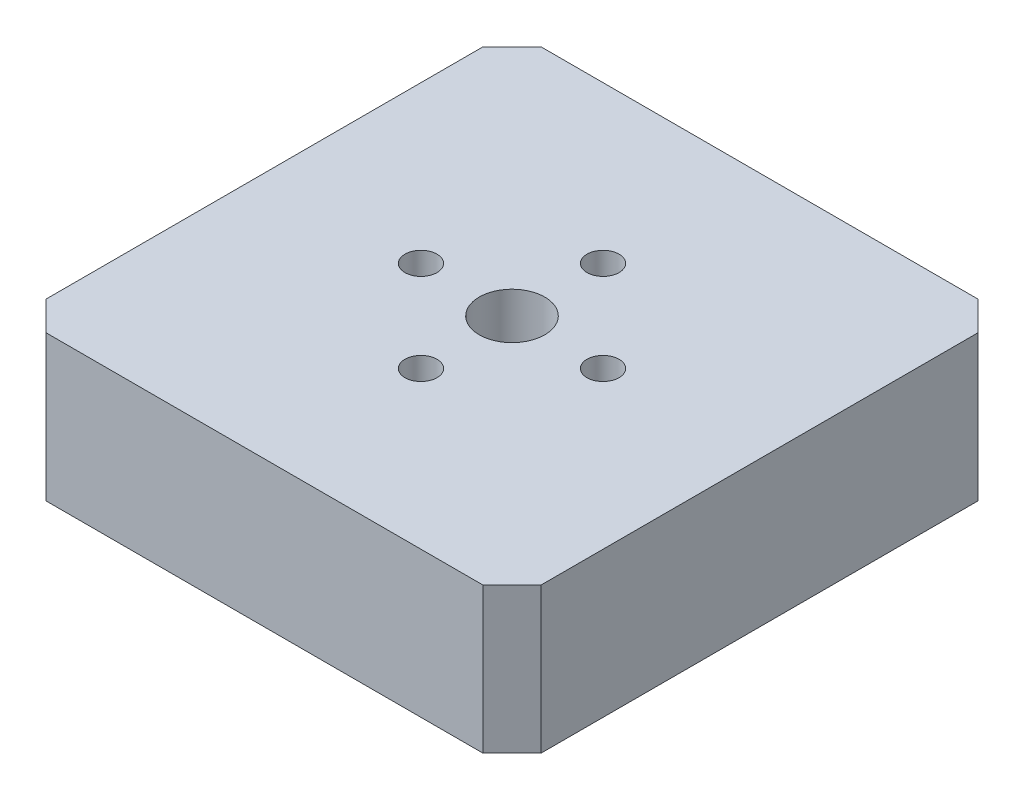
ISO-10303-21;
HEADER;
FILE_DESCRIPTION(('STEP AP214'),'2;1');
FILE_NAME('part.step','',(''),(''),'','','');
FILE_SCHEMA(('AUTOMOTIVE_DESIGN { 1 0 10303 214 1 1 1 1 }'));
ENDSEC;
DATA;
#1=APPLICATION_CONTEXT('core data for automotive mechanical design processes');
#2=APPLICATION_PROTOCOL_DEFINITION('international standard','automotive_design',2000,#1);
#3=PRODUCT_CONTEXT('',#1,'mechanical');
#4=PRODUCT('Part','Part','',(#3));
#5=PRODUCT_RELATED_PRODUCT_CATEGORY('part','',(#4));
#6=PRODUCT_DEFINITION_FORMATION('','',#4);
#7=PRODUCT_DEFINITION_CONTEXT('part definition',#1,'design');
#8=PRODUCT_DEFINITION('design','',#6,#7);
#9=PRODUCT_DEFINITION_SHAPE('','',#8);
#10=(LENGTH_UNIT() NAMED_UNIT(*) SI_UNIT(.MILLI.,.METRE.));
#11=(NAMED_UNIT(*) PLANE_ANGLE_UNIT() SI_UNIT($,.RADIAN.));
#12=(NAMED_UNIT(*) SI_UNIT($,.STERADIAN.) SOLID_ANGLE_UNIT());
#13=UNCERTAINTY_MEASURE_WITH_UNIT(LENGTH_MEASURE(1.E-05),#10,'distance_accuracy_value','');
#14=(GEOMETRIC_REPRESENTATION_CONTEXT(3) GLOBAL_UNCERTAINTY_ASSIGNED_CONTEXT((#13)) GLOBAL_UNIT_ASSIGNED_CONTEXT((#10,
#11,#12)) REPRESENTATION_CONTEXT('',''));
#15=CARTESIAN_POINT('',(0.,0.,0.));
#16=DIRECTION('',(0.,0.,1.));
#17=DIRECTION('',(1.,0.,0.));
#18=AXIS2_PLACEMENT_3D('',#15,#16,#17);
#19=CARTESIAN_POINT('',(0.,0.,0.));
#20=DIRECTION('',(0.,-1.,0.));
#21=DIRECTION('',(0.,0.,-1.));
#22=AXIS2_PLACEMENT_3D('',#19,#20,#21);
#23=PLANE('',#22);
#24=DIRECTION('',(1.,0.,0.));
#25=VECTOR('',#24,1.);
#26=CARTESIAN_POINT('',(-17.,0.,17.));
#27=LINE('',#26,#25);
#28=CARTESIAN_POINT('',(-15.,0.,17.));
#29=VERTEX_POINT('',#28);
#30=CARTESIAN_POINT('',(15.,0.,17.));
#31=VERTEX_POINT('',#30);
#32=EDGE_CURVE('E216',#29,#31,#27,.T.);
#33=ORIENTED_EDGE('',*,*,#32,.F.);
#34=DIRECTION('',(-0.707106781186546,0.,-0.707106781186549));
#35=VECTOR('',#34,1.);
#36=CARTESIAN_POINT('',(-16.,0.,16.));
#37=LINE('',#36,#35);
#38=CARTESIAN_POINT('',(-17.,0.,15.));
#39=VERTEX_POINT('',#38);
#40=EDGE_CURVE('E266',#29,#39,#37,.T.);
#41=ORIENTED_EDGE('',*,*,#40,.T.);
#42=DIRECTION('',(0.,0.,-1.));
#43=VECTOR('',#42,1.);
#44=CARTESIAN_POINT('',(-17.,0.,17.));
#45=LINE('',#44,#43);
#46=CARTESIAN_POINT('',(-17.,0.,-15.));
#47=VERTEX_POINT('',#46);
#48=EDGE_CURVE('E210',#39,#47,#45,.T.);
#49=ORIENTED_EDGE('',*,*,#48,.T.);
#50=DIRECTION('',(-0.707106781186549,0.,0.707106781186546));
#51=VECTOR('',#50,1.);
#52=CARTESIAN_POINT('',(-16.,0.,-16.));
#53=LINE('',#52,#51);
#54=CARTESIAN_POINT('',(-15.,0.,-17.));
#55=VERTEX_POINT('',#54);
#56=EDGE_CURVE('E260',#47,#55,#53,.F.);
#57=ORIENTED_EDGE('',*,*,#56,.T.);
#58=DIRECTION('',(1.,0.,0.));
#59=VECTOR('',#58,1.);
#60=CARTESIAN_POINT('',(-17.,0.,-17.));
#61=LINE('',#60,#59);
#62=CARTESIAN_POINT('',(15.,0.,-17.));
#63=VERTEX_POINT('',#62);
#64=EDGE_CURVE('E225',#55,#63,#61,.T.);
#65=ORIENTED_EDGE('',*,*,#64,.T.);
#66=DIRECTION('',(0.707106781186546,0.,0.707106781186549));
#67=VECTOR('',#66,1.);
#68=CARTESIAN_POINT('',(16.,0.,-16.));
#69=LINE('',#68,#67);
#70=CARTESIAN_POINT('',(17.,0.,-15.));
#71=VERTEX_POINT('',#70);
#72=EDGE_CURVE('E262',#63,#71,#69,.T.);
#73=ORIENTED_EDGE('',*,*,#72,.T.);
#74=DIRECTION('',(0.,0.,-1.));
#75=VECTOR('',#74,1.);
#76=CARTESIAN_POINT('',(17.,0.,17.));
#77=LINE('',#76,#75);
#78=CARTESIAN_POINT('',(17.,0.,15.));
#79=VERTEX_POINT('',#78);
#80=EDGE_CURVE('E228',#79,#71,#77,.T.);
#81=ORIENTED_EDGE('',*,*,#80,.F.);
#82=DIRECTION('',(0.707106781186549,0.,-0.707106781186546));
#83=VECTOR('',#82,1.);
#84=CARTESIAN_POINT('',(16.,0.,16.));
#85=LINE('',#84,#83);
#86=EDGE_CURVE('E264',#79,#31,#85,.F.);
#87=ORIENTED_EDGE('',*,*,#86,.T.);
#88=EDGE_LOOP('',(#33,#41,#49,#57,#65,#73,#81,#87));
#89=FACE_BOUND('',#88,.T.);
#90=DIRECTION('',(0.,0.,-1.));
#91=VECTOR('',#90,1.);
#92=CARTESIAN_POINT('',(-15.,0.,0.));
#93=LINE('',#92,#91);
#94=CARTESIAN_POINT('',(-15.,0.,13.));
#95=VERTEX_POINT('',#94);
#96=CARTESIAN_POINT('',(-15.,0.,-13.));
#97=VERTEX_POINT('',#96);
#98=EDGE_CURVE('E198',#95,#97,#93,.T.);
#99=ORIENTED_EDGE('',*,*,#98,.F.);
#100=DIRECTION('',(0.707106781186544,0.,0.707106781186551));
#101=VECTOR('',#100,1.);
#102=CARTESIAN_POINT('',(-15.,0.,13.));
#103=LINE('',#102,#101);
#104=CARTESIAN_POINT('',(-13.,0.,15.));
#105=VERTEX_POINT('',#104);
#106=EDGE_CURVE('E12',#95,#105,#103,.T.);
#107=ORIENTED_EDGE('',*,*,#106,.T.);
#108=DIRECTION('',(1.,0.,0.));
#109=VECTOR('',#108,1.);
#110=CARTESIAN_POINT('',(0.,0.,15.));
#111=LINE('',#110,#109);
#112=CARTESIAN_POINT('',(13.,0.,15.));
#113=VERTEX_POINT('',#112);
#114=EDGE_CURVE('E203',#105,#113,#111,.T.);
#115=ORIENTED_EDGE('',*,*,#114,.T.);
#116=DIRECTION('',(-0.707106781186551,0.,0.707106781186544));
#117=VECTOR('',#116,1.);
#118=CARTESIAN_POINT('',(13.,0.,15.));
#119=LINE('',#118,#117);
#120=CARTESIAN_POINT('',(15.,0.,13.));
#121=VERTEX_POINT('',#120);
#122=EDGE_CURVE('E67',#113,#121,#119,.F.);
#123=ORIENTED_EDGE('',*,*,#122,.T.);
#124=DIRECTION('',(0.,0.,-1.));
#125=VECTOR('',#124,1.);
#126=CARTESIAN_POINT('',(15.,0.,0.));
#127=LINE('',#126,#125);
#128=CARTESIAN_POINT('',(15.,0.,-13.));
#129=VERTEX_POINT('',#128);
#130=EDGE_CURVE('E199',#121,#129,#127,.T.);
#131=ORIENTED_EDGE('',*,*,#130,.T.);
#132=DIRECTION('',(-0.707106781186544,0.,-0.707106781186551));
#133=VECTOR('',#132,1.);
#134=CARTESIAN_POINT('',(15.,0.,-13.));
#135=LINE('',#134,#133);
#136=CARTESIAN_POINT('',(13.,0.,-15.));
#137=VERTEX_POINT('',#136);
#138=EDGE_CURVE('E183',#129,#137,#135,.T.);
#139=ORIENTED_EDGE('',*,*,#138,.T.);
#140=DIRECTION('',(1.,0.,0.));
#141=VECTOR('',#140,1.);
#142=CARTESIAN_POINT('',(0.,0.,-15.));
#143=LINE('',#142,#141);
#144=CARTESIAN_POINT('',(-13.,0.,-15.));
#145=VERTEX_POINT('',#144);
#146=EDGE_CURVE('E190',#145,#137,#143,.T.);
#147=ORIENTED_EDGE('',*,*,#146,.F.);
#148=DIRECTION('',(0.707106781186551,0.,-0.707106781186544));
#149=VECTOR('',#148,1.);
#150=CARTESIAN_POINT('',(-13.,0.,-15.));
#151=LINE('',#150,#149);
#152=EDGE_CURVE('E173',#145,#97,#151,.F.);
#153=ORIENTED_EDGE('',*,*,#152,.T.);
#154=EDGE_LOOP('',(#99,#107,#115,#123,#131,#139,#147,#153));
#155=FACE_BOUND('',#154,.T.);
#156=ADVANCED_FACE('F58',(#89,#155),#23,.T.);
#157=CARTESIAN_POINT('',(0.,10.,0.));
#158=DIRECTION('',(0.,-1.,0.));
#159=DIRECTION('',(0.,0.,-1.));
#160=AXIS2_PLACEMENT_3D('',#157,#158,#159);
#161=PLANE('',#160);
#162=CARTESIAN_POINT('',(0.,10.,-6.25));
#163=DIRECTION('',(0.,-1.,0.));
#164=DIRECTION('',(0.,0.,-1.));
#165=AXIS2_PLACEMENT_3D('',#162,#163,#164);
#166=CIRCLE('',#165,1.1);
#167=CARTESIAN_POINT('',(0.,10.,-7.35));
#168=VERTEX_POINT('',#167);
#169=EDGE_CURVE('E357',#168,#168,#166,.T.);
#170=ORIENTED_EDGE('',*,*,#169,.T.);
#171=EDGE_LOOP('',(#170));
#172=FACE_BOUND('',#171,.T.);
#173=CARTESIAN_POINT('',(-6.25,10.,0.));
#174=DIRECTION('',(0.,-1.,0.));
#175=DIRECTION('',(0.,0.,-1.));
#176=AXIS2_PLACEMENT_3D('',#173,#174,#175);
#177=CIRCLE('',#176,1.1);
#178=CARTESIAN_POINT('',(-6.25,10.,-1.1));
#179=VERTEX_POINT('',#178);
#180=EDGE_CURVE('E345',#179,#179,#177,.T.);
#181=ORIENTED_EDGE('',*,*,#180,.T.);
#182=EDGE_LOOP('',(#181));
#183=FACE_BOUND('',#182,.T.);
#184=CARTESIAN_POINT('',(0.,10.,6.25));
#185=DIRECTION('',(0.,-1.,0.));
#186=DIRECTION('',(0.,0.,-1.));
#187=AXIS2_PLACEMENT_3D('',#184,#185,#186);
#188=CIRCLE('',#187,1.1);
#189=CARTESIAN_POINT('',(0.,10.,5.15));
#190=VERTEX_POINT('',#189);
#191=EDGE_CURVE('E333',#190,#190,#188,.T.);
#192=ORIENTED_EDGE('',*,*,#191,.T.);
#193=EDGE_LOOP('',(#192));
#194=FACE_BOUND('',#193,.T.);
#195=CARTESIAN_POINT('',(6.25,10.,0.));
#196=DIRECTION('',(0.,-1.,0.));
#197=DIRECTION('',(0.,0.,-1.));
#198=AXIS2_PLACEMENT_3D('',#195,#196,#197);
#199=CIRCLE('',#198,1.1);
#200=CARTESIAN_POINT('',(6.25,10.,-1.1));
#201=VERTEX_POINT('',#200);
#202=EDGE_CURVE('E319',#201,#201,#199,.T.);
#203=ORIENTED_EDGE('',*,*,#202,.T.);
#204=EDGE_LOOP('',(#203));
#205=FACE_BOUND('',#204,.T.);
#206=DIRECTION('',(0.,0.,-1.));
#207=VECTOR('',#206,1.);
#208=CARTESIAN_POINT('',(-17.,10.,17.));
#209=LINE('',#208,#207);
#210=CARTESIAN_POINT('',(-17.,10.,15.));
#211=VERTEX_POINT('',#210);
#212=CARTESIAN_POINT('',(-17.,10.,-15.));
#213=VERTEX_POINT('',#212);
#214=EDGE_CURVE('E212',#211,#213,#209,.T.);
#215=ORIENTED_EDGE('',*,*,#214,.F.);
#216=DIRECTION('',(0.707106781186546,0.,0.707106781186549));
#217=VECTOR('',#216,1.);
#218=CARTESIAN_POINT('',(-15.,10.,17.));
#219=LINE('',#218,#217);
#220=CARTESIAN_POINT('',(-15.,10.,17.));
#221=VERTEX_POINT('',#220);
#222=EDGE_CURVE('E278',#211,#221,#219,.T.);
#223=ORIENTED_EDGE('',*,*,#222,.T.);
#224=DIRECTION('',(1.,0.,0.));
#225=VECTOR('',#224,1.);
#226=CARTESIAN_POINT('',(-17.,10.,17.));
#227=LINE('',#226,#225);
#228=CARTESIAN_POINT('',(15.,10.,17.));
#229=VERTEX_POINT('',#228);
#230=EDGE_CURVE('E220',#221,#229,#227,.T.);
#231=ORIENTED_EDGE('',*,*,#230,.T.);
#232=DIRECTION('',(-0.707106781186549,0.,0.707106781186546));
#233=VECTOR('',#232,1.);
#234=CARTESIAN_POINT('',(17.,10.,15.));
#235=LINE('',#234,#233);
#236=CARTESIAN_POINT('',(17.,10.,15.));
#237=VERTEX_POINT('',#236);
#238=EDGE_CURVE('E276',#229,#237,#235,.F.);
#239=ORIENTED_EDGE('',*,*,#238,.T.);
#240=DIRECTION('',(0.,0.,-1.));
#241=VECTOR('',#240,1.);
#242=CARTESIAN_POINT('',(17.,10.,17.));
#243=LINE('',#242,#241);
#244=CARTESIAN_POINT('',(17.,10.,-15.));
#245=VERTEX_POINT('',#244);
#246=EDGE_CURVE('E218',#237,#245,#243,.T.);
#247=ORIENTED_EDGE('',*,*,#246,.T.);
#248=DIRECTION('',(-0.707106781186546,0.,-0.707106781186549));
#249=VECTOR('',#248,1.);
#250=CARTESIAN_POINT('',(15.,10.,-17.));
#251=LINE('',#250,#249);
#252=CARTESIAN_POINT('',(15.,10.,-17.));
#253=VERTEX_POINT('',#252);
#254=EDGE_CURVE('E74',#245,#253,#251,.T.);
#255=ORIENTED_EDGE('',*,*,#254,.T.);
#256=DIRECTION('',(1.,0.,0.));
#257=VECTOR('',#256,1.);
#258=CARTESIAN_POINT('',(-17.,10.,-17.));
#259=LINE('',#258,#257);
#260=CARTESIAN_POINT('',(-15.,10.,-17.));
#261=VERTEX_POINT('',#260);
#262=EDGE_CURVE('E215',#261,#253,#259,.T.);
#263=ORIENTED_EDGE('',*,*,#262,.F.);
#264=DIRECTION('',(0.707106781186549,0.,-0.707106781186546));
#265=VECTOR('',#264,1.);
#266=CARTESIAN_POINT('',(-17.,10.,-15.));
#267=LINE('',#266,#265);
#268=EDGE_CURVE('E273',#261,#213,#267,.F.);
#269=ORIENTED_EDGE('',*,*,#268,.T.);
#270=EDGE_LOOP('',(#215,#223,#231,#239,#247,#255,#263,#269));
#271=FACE_BOUND('',#270,.T.);
#272=CARTESIAN_POINT('',(0.,10.,0.));
#273=DIRECTION('',(0.,1.,0.));
#274=DIRECTION('',(0.,0.,1.));
#275=AXIS2_PLACEMENT_3D('',#272,#273,#274);
#276=CIRCLE('',#275,2.25);
#277=CARTESIAN_POINT('',(0.,10.,2.25));
#278=VERTEX_POINT('',#277);
#279=EDGE_CURVE('E207',#278,#278,#276,.T.);
#280=ORIENTED_EDGE('',*,*,#279,.F.);
#281=EDGE_LOOP('',(#280));
#282=FACE_BOUND('',#281,.T.);
#283=ADVANCED_FACE('F391',(#172,#183,#194,#205,#271,#282),#161,.F.);
#284=CARTESIAN_POINT('',(-17.,10.,17.));
#285=DIRECTION('',(-1.,0.,0.));
#286=DIRECTION('',(0.,0.,1.));
#287=AXIS2_PLACEMENT_3D('',#284,#285,#286);
#288=PLANE('',#287);
#289=ORIENTED_EDGE('',*,*,#48,.F.);
#290=DIRECTION('',(0.,1.,0.));
#291=VECTOR('',#290,1.);
#292=CARTESIAN_POINT('',(-17.,10.,15.));
#293=LINE('',#292,#291);
#294=EDGE_CURVE('E271',#39,#211,#293,.T.);
#295=ORIENTED_EDGE('',*,*,#294,.T.);
#296=ORIENTED_EDGE('',*,*,#214,.T.);
#297=DIRECTION('',(0.,-1.,0.));
#298=VECTOR('',#297,1.);
#299=CARTESIAN_POINT('',(-17.,10.,-15.));
#300=LINE('',#299,#298);
#301=EDGE_CURVE('E268',#213,#47,#300,.T.);
#302=ORIENTED_EDGE('',*,*,#301,.T.);
#303=EDGE_LOOP('',(#289,#295,#296,#302));
#304=FACE_BOUND('',#303,.T.);
#305=ADVANCED_FACE('F393',(#304),#288,.T.);
#306=CARTESIAN_POINT('',(-17.,10.,17.));
#307=DIRECTION('',(0.,0.,-1.));
#308=DIRECTION('',(-1.,0.,0.));
#309=AXIS2_PLACEMENT_3D('',#306,#307,#308);
#310=PLANE('',#309);
#311=ORIENTED_EDGE('',*,*,#230,.F.);
#312=DIRECTION('',(0.,-1.,0.));
#313=VECTOR('',#312,1.);
#314=CARTESIAN_POINT('',(-15.,0.,17.));
#315=LINE('',#314,#313);
#316=EDGE_CURVE('E257',#221,#29,#315,.T.);
#317=ORIENTED_EDGE('',*,*,#316,.T.);
#318=ORIENTED_EDGE('',*,*,#32,.T.);
#319=DIRECTION('',(0.,1.,0.));
#320=VECTOR('',#319,1.);
#321=CARTESIAN_POINT('',(15.,10.,17.));
#322=LINE('',#321,#320);
#323=EDGE_CURVE('E255',#31,#229,#322,.T.);
#324=ORIENTED_EDGE('',*,*,#323,.T.);
#325=EDGE_LOOP('',(#311,#317,#318,#324));
#326=FACE_BOUND('',#325,.T.);
#327=ADVANCED_FACE('F400',(#326),#310,.F.);
#328=CARTESIAN_POINT('',(17.,10.,17.));
#329=DIRECTION('',(-1.,0.,0.));
#330=DIRECTION('',(0.,0.,1.));
#331=AXIS2_PLACEMENT_3D('',#328,#329,#330);
#332=PLANE('',#331);
#333=ORIENTED_EDGE('',*,*,#246,.F.);
#334=DIRECTION('',(0.,-1.,0.));
#335=VECTOR('',#334,1.);
#336=CARTESIAN_POINT('',(17.,10.,15.));
#337=LINE('',#336,#335);
#338=EDGE_CURVE('E282',#237,#79,#337,.T.);
#339=ORIENTED_EDGE('',*,*,#338,.T.);
#340=ORIENTED_EDGE('',*,*,#80,.T.);
#341=DIRECTION('',(0.,1.,0.));
#342=VECTOR('',#341,1.);
#343=CARTESIAN_POINT('',(17.,10.,-15.));
#344=LINE('',#343,#342);
#345=EDGE_CURVE('E280',#71,#245,#344,.T.);
#346=ORIENTED_EDGE('',*,*,#345,.T.);
#347=EDGE_LOOP('',(#333,#339,#340,#346));
#348=FACE_BOUND('',#347,.T.);
#349=ADVANCED_FACE('F411',(#348),#332,.F.);
#350=CARTESIAN_POINT('',(-17.,10.,-17.));
#351=DIRECTION('',(0.,0.,-1.));
#352=DIRECTION('',(-1.,0.,0.));
#353=AXIS2_PLACEMENT_3D('',#350,#351,#352);
#354=PLANE('',#353);
#355=ORIENTED_EDGE('',*,*,#262,.T.);
#356=DIRECTION('',(0.,-1.,0.));
#357=VECTOR('',#356,1.);
#358=CARTESIAN_POINT('',(15.,0.,-17.));
#359=LINE('',#358,#357);
#360=EDGE_CURVE('E184',#253,#63,#359,.T.);
#361=ORIENTED_EDGE('',*,*,#360,.T.);
#362=ORIENTED_EDGE('',*,*,#64,.F.);
#363=DIRECTION('',(0.,1.,0.));
#364=VECTOR('',#363,1.);
#365=CARTESIAN_POINT('',(-15.,10.,-17.));
#366=LINE('',#365,#364);
#367=EDGE_CURVE('E81',#55,#261,#366,.T.);
#368=ORIENTED_EDGE('',*,*,#367,.T.);
#369=EDGE_LOOP('',(#355,#361,#362,#368));
#370=FACE_BOUND('',#369,.T.);
#371=ADVANCED_FACE('F387',(#370),#354,.T.);
#372=CARTESIAN_POINT('',(0.,10.,0.));
#373=DIRECTION('',(0.,-1.,0.));
#374=DIRECTION('',(0.,0.,-1.));
#375=AXIS2_PLACEMENT_3D('',#372,#373,#374);
#376=CYLINDRICAL_SURFACE('',#375,2.25);
#377=CARTESIAN_POINT('',(0.,6.,0.));
#378=DIRECTION('',(0.,1.,0.));
#379=DIRECTION('',(0.,0.,1.));
#380=AXIS2_PLACEMENT_3D('',#377,#378,#379);
#381=CIRCLE('',#380,2.25);
#382=CARTESIAN_POINT('',(0.,6.,2.25));
#383=VERTEX_POINT('',#382);
#384=EDGE_CURVE('E201',#383,#383,#381,.T.);
#385=ORIENTED_EDGE('',*,*,#384,.F.);
#386=EDGE_LOOP('',(#385));
#387=FACE_BOUND('',#386,.T.);
#388=ORIENTED_EDGE('',*,*,#279,.T.);
#389=EDGE_LOOP('',(#388));
#390=FACE_BOUND('',#389,.T.);
#391=ADVANCED_FACE('F384',(#387,#390),#376,.F.);
#392=CARTESIAN_POINT('',(0.,6.,15.));
#393=DIRECTION('',(0.,0.,-1.));
#394=DIRECTION('',(-1.,0.,0.));
#395=AXIS2_PLACEMENT_3D('',#392,#393,#394);
#396=PLANE('',#395);
#397=DIRECTION('',(1.,0.,0.));
#398=VECTOR('',#397,1.);
#399=CARTESIAN_POINT('',(0.,6.,15.));
#400=LINE('',#399,#398);
#401=CARTESIAN_POINT('',(-13.,6.,15.));
#402=VERTEX_POINT('',#401);
#403=CARTESIAN_POINT('',(13.,6.,15.));
#404=VERTEX_POINT('',#403);
#405=EDGE_CURVE('E306',#402,#404,#400,.T.);
#406=ORIENTED_EDGE('',*,*,#405,.T.);
#407=DIRECTION('',(0.,-1.,0.));
#408=VECTOR('',#407,1.);
#409=CARTESIAN_POINT('',(13.,0.,15.));
#410=LINE('',#409,#408);
#411=EDGE_CURVE('E252',#404,#113,#410,.T.);
#412=ORIENTED_EDGE('',*,*,#411,.T.);
#413=ORIENTED_EDGE('',*,*,#114,.F.);
#414=DIRECTION('',(0.,1.,0.));
#415=VECTOR('',#414,1.);
#416=CARTESIAN_POINT('',(-13.,6.,15.));
#417=LINE('',#416,#415);
#418=EDGE_CURVE('E250',#105,#402,#417,.T.);
#419=ORIENTED_EDGE('',*,*,#418,.T.);
#420=EDGE_LOOP('',(#406,#412,#413,#419));
#421=FACE_BOUND('',#420,.T.);
#422=ADVANCED_FACE('F310',(#421),#396,.T.);
#423=CARTESIAN_POINT('',(15.,6.,0.));
#424=DIRECTION('',(-1.,0.,0.));
#425=DIRECTION('',(0.,0.,1.));
#426=AXIS2_PLACEMENT_3D('',#423,#424,#425);
#427=PLANE('',#426);
#428=DIRECTION('',(0.,0.,-1.));
#429=VECTOR('',#428,1.);
#430=CARTESIAN_POINT('',(15.,6.,0.));
#431=LINE('',#430,#429);
#432=CARTESIAN_POINT('',(15.,6.,13.));
#433=VERTEX_POINT('',#432);
#434=CARTESIAN_POINT('',(15.,6.,-13.));
#435=VERTEX_POINT('',#434);
#436=EDGE_CURVE('E308',#433,#435,#431,.T.);
#437=ORIENTED_EDGE('',*,*,#436,.T.);
#438=DIRECTION('',(0.,-1.,0.));
#439=VECTOR('',#438,1.);
#440=CARTESIAN_POINT('',(15.,6.,-13.));
#441=LINE('',#440,#439);
#442=EDGE_CURVE('E247',#435,#129,#441,.T.);
#443=ORIENTED_EDGE('',*,*,#442,.T.);
#444=ORIENTED_EDGE('',*,*,#130,.F.);
#445=DIRECTION('',(0.,1.,0.));
#446=VECTOR('',#445,1.);
#447=CARTESIAN_POINT('',(15.,6.,13.));
#448=LINE('',#447,#446);
#449=EDGE_CURVE('E245',#121,#433,#448,.T.);
#450=ORIENTED_EDGE('',*,*,#449,.T.);
#451=EDGE_LOOP('',(#437,#443,#444,#450));
#452=FACE_BOUND('',#451,.T.);
#453=ADVANCED_FACE('F296',(#452),#427,.T.);
#454=CARTESIAN_POINT('',(0.,6.,-15.));
#455=DIRECTION('',(0.,0.,-1.));
#456=DIRECTION('',(-1.,0.,0.));
#457=AXIS2_PLACEMENT_3D('',#454,#455,#456);
#458=PLANE('',#457);
#459=DIRECTION('',(1.,0.,0.));
#460=VECTOR('',#459,1.);
#461=CARTESIAN_POINT('',(0.,6.,-15.));
#462=LINE('',#461,#460);
#463=CARTESIAN_POINT('',(-13.,6.,-15.));
#464=VERTEX_POINT('',#463);
#465=CARTESIAN_POINT('',(13.,6.,-15.));
#466=VERTEX_POINT('',#465);
#467=EDGE_CURVE('E193',#464,#466,#462,.T.);
#468=ORIENTED_EDGE('',*,*,#467,.F.);
#469=DIRECTION('',(0.,-1.,0.));
#470=VECTOR('',#469,1.);
#471=CARTESIAN_POINT('',(-13.,0.,-15.));
#472=LINE('',#471,#470);
#473=EDGE_CURVE('E177',#464,#145,#472,.T.);
#474=ORIENTED_EDGE('',*,*,#473,.T.);
#475=ORIENTED_EDGE('',*,*,#146,.T.);
#476=DIRECTION('',(0.,1.,0.));
#477=VECTOR('',#476,1.);
#478=CARTESIAN_POINT('',(13.,6.,-15.));
#479=LINE('',#478,#477);
#480=EDGE_CURVE('E195',#137,#466,#479,.T.);
#481=ORIENTED_EDGE('',*,*,#480,.T.);
#482=EDGE_LOOP('',(#468,#474,#475,#481));
#483=FACE_BOUND('',#482,.T.);
#484=ADVANCED_FACE('F189',(#483),#458,.F.);
#485=CARTESIAN_POINT('',(-15.,6.,0.));
#486=DIRECTION('',(-1.,0.,0.));
#487=DIRECTION('',(0.,0.,1.));
#488=AXIS2_PLACEMENT_3D('',#485,#486,#487);
#489=PLANE('',#488);
#490=ORIENTED_EDGE('',*,*,#98,.T.);
#491=DIRECTION('',(0.,1.,0.));
#492=VECTOR('',#491,1.);
#493=CARTESIAN_POINT('',(-15.,6.,-13.));
#494=LINE('',#493,#492);
#495=CARTESIAN_POINT('',(-15.,6.,-13.));
#496=VERTEX_POINT('',#495);
#497=EDGE_CURVE('E178',#97,#496,#494,.T.);
#498=ORIENTED_EDGE('',*,*,#497,.T.);
#499=DIRECTION('',(0.,0.,-1.));
#500=VECTOR('',#499,1.);
#501=CARTESIAN_POINT('',(-15.,6.,0.));
#502=LINE('',#501,#500);
#503=CARTESIAN_POINT('',(-15.,6.,13.));
#504=VERTEX_POINT('',#503);
#505=EDGE_CURVE('E211',#504,#496,#502,.T.);
#506=ORIENTED_EDGE('',*,*,#505,.F.);
#507=DIRECTION('',(0.,-1.,0.));
#508=VECTOR('',#507,1.);
#509=CARTESIAN_POINT('',(-15.,6.,13.));
#510=LINE('',#509,#508);
#511=EDGE_CURVE('E194',#504,#95,#510,.T.);
#512=ORIENTED_EDGE('',*,*,#511,.T.);
#513=EDGE_LOOP('',(#490,#498,#506,#512));
#514=FACE_BOUND('',#513,.T.);
#515=ADVANCED_FACE('F374',(#514),#489,.F.);
#516=CARTESIAN_POINT('',(0.,6.,0.));
#517=DIRECTION('',(0.,1.,0.));
#518=DIRECTION('',(0.,0.,1.));
#519=AXIS2_PLACEMENT_3D('',#516,#517,#518);
#520=PLANE('',#519);
#521=CARTESIAN_POINT('',(0.,6.,-6.25));
#522=DIRECTION('',(0.,-1.,0.));
#523=DIRECTION('',(0.,0.,-1.));
#524=AXIS2_PLACEMENT_3D('',#521,#522,#523);
#525=CIRCLE('',#524,2.15);
#526=CARTESIAN_POINT('',(0.,6.,-8.4));
#527=VERTEX_POINT('',#526);
#528=EDGE_CURVE('E366',#527,#527,#525,.T.);
#529=ORIENTED_EDGE('',*,*,#528,.F.);
#530=EDGE_LOOP('',(#529));
#531=FACE_BOUND('',#530,.T.);
#532=CARTESIAN_POINT('',(-6.25,6.,0.));
#533=DIRECTION('',(0.,-1.,0.));
#534=DIRECTION('',(0.,0.,-1.));
#535=AXIS2_PLACEMENT_3D('',#532,#533,#534);
#536=CIRCLE('',#535,2.15);
#537=CARTESIAN_POINT('',(-6.25,6.,-2.15));
#538=VERTEX_POINT('',#537);
#539=EDGE_CURVE('E354',#538,#538,#536,.T.);
#540=ORIENTED_EDGE('',*,*,#539,.F.);
#541=EDGE_LOOP('',(#540));
#542=FACE_BOUND('',#541,.T.);
#543=CARTESIAN_POINT('',(0.,6.,6.25));
#544=DIRECTION('',(0.,-1.,0.));
#545=DIRECTION('',(0.,0.,-1.));
#546=AXIS2_PLACEMENT_3D('',#543,#544,#545);
#547=CIRCLE('',#546,2.15);
#548=CARTESIAN_POINT('',(0.,6.,4.1));
#549=VERTEX_POINT('',#548);
#550=EDGE_CURVE('E342',#549,#549,#547,.T.);
#551=ORIENTED_EDGE('',*,*,#550,.F.);
#552=EDGE_LOOP('',(#551));
#553=FACE_BOUND('',#552,.T.);
#554=CARTESIAN_POINT('',(6.25,6.,0.));
#555=DIRECTION('',(0.,-1.,0.));
#556=DIRECTION('',(0.,0.,-1.));
#557=AXIS2_PLACEMENT_3D('',#554,#555,#556);
#558=CIRCLE('',#557,2.15);
#559=CARTESIAN_POINT('',(6.25,6.,-2.15));
#560=VERTEX_POINT('',#559);
#561=EDGE_CURVE('E330',#560,#560,#558,.T.);
#562=ORIENTED_EDGE('',*,*,#561,.F.);
#563=EDGE_LOOP('',(#562));
#564=FACE_BOUND('',#563,.T.);
#565=ORIENTED_EDGE('',*,*,#384,.T.);
#566=EDGE_LOOP('',(#565));
#567=FACE_BOUND('',#566,.T.);
#568=ORIENTED_EDGE('',*,*,#505,.T.);
#569=DIRECTION('',(-0.707106781186551,0.,0.707106781186544));
#570=VECTOR('',#569,1.);
#571=CARTESIAN_POINT('',(-13.,6.,-15.));
#572=LINE('',#571,#570);
#573=EDGE_CURVE('E243',#496,#464,#572,.F.);
#574=ORIENTED_EDGE('',*,*,#573,.T.);
#575=ORIENTED_EDGE('',*,*,#467,.T.);
#576=DIRECTION('',(0.707106781186544,0.,0.707106781186551));
#577=VECTOR('',#576,1.);
#578=CARTESIAN_POINT('',(15.,6.,-13.));
#579=LINE('',#578,#577);
#580=EDGE_CURVE('E241',#466,#435,#579,.T.);
#581=ORIENTED_EDGE('',*,*,#580,.T.);
#582=ORIENTED_EDGE('',*,*,#436,.F.);
#583=DIRECTION('',(0.707106781186551,0.,-0.707106781186544));
#584=VECTOR('',#583,1.);
#585=CARTESIAN_POINT('',(13.,6.,15.));
#586=LINE('',#585,#584);
#587=EDGE_CURVE('E239',#433,#404,#586,.F.);
#588=ORIENTED_EDGE('',*,*,#587,.T.);
#589=ORIENTED_EDGE('',*,*,#405,.F.);
#590=DIRECTION('',(-0.707106781186544,0.,-0.707106781186551));
#591=VECTOR('',#590,1.);
#592=CARTESIAN_POINT('',(-15.,6.,13.));
#593=LINE('',#592,#591);
#594=EDGE_CURVE('E237',#402,#504,#593,.T.);
#595=ORIENTED_EDGE('',*,*,#594,.T.);
#596=EDGE_LOOP('',(#568,#574,#575,#581,#582,#588,#589,#595));
#597=FACE_BOUND('',#596,.T.);
#598=ADVANCED_FACE('F305',(#531,#542,#553,#564,#567,#597),#520,.F.);
#599=CARTESIAN_POINT('',(-13.,6.,-15.));
#600=DIRECTION('',(0.707106781186544,0.,0.707106781186551));
#601=DIRECTION('',(0.,1.,0.));
#602=AXIS2_PLACEMENT_3D('',#599,#600,#601);
#603=PLANE('',#602);
#604=ORIENTED_EDGE('',*,*,#573,.F.);
#605=ORIENTED_EDGE('',*,*,#497,.F.);
#606=ORIENTED_EDGE('',*,*,#152,.F.);
#607=ORIENTED_EDGE('',*,*,#473,.F.);
#608=EDGE_LOOP('',(#604,#605,#606,#607));
#609=FACE_BOUND('',#608,.T.);
#610=ADVANCED_FACE('F176',(#609),#603,.T.);
#611=CARTESIAN_POINT('',(15.,6.,-13.));
#612=DIRECTION('',(0.707106781186551,0.,-0.707106781186544));
#613=DIRECTION('',(0.,-1.,0.));
#614=AXIS2_PLACEMENT_3D('',#611,#612,#613);
#615=PLANE('',#614);
#616=ORIENTED_EDGE('',*,*,#580,.F.);
#617=ORIENTED_EDGE('',*,*,#480,.F.);
#618=ORIENTED_EDGE('',*,*,#138,.F.);
#619=ORIENTED_EDGE('',*,*,#442,.F.);
#620=EDGE_LOOP('',(#616,#617,#618,#619));
#621=FACE_BOUND('',#620,.T.);
#622=ADVANCED_FACE('F424',(#621),#615,.F.);
#623=CARTESIAN_POINT('',(13.,6.,15.));
#624=DIRECTION('',(-0.707106781186544,0.,-0.707106781186551));
#625=DIRECTION('',(0.,1.,0.));
#626=AXIS2_PLACEMENT_3D('',#623,#624,#625);
#627=PLANE('',#626);
#628=ORIENTED_EDGE('',*,*,#587,.F.);
#629=ORIENTED_EDGE('',*,*,#449,.F.);
#630=ORIENTED_EDGE('',*,*,#122,.F.);
#631=ORIENTED_EDGE('',*,*,#411,.F.);
#632=EDGE_LOOP('',(#628,#629,#630,#631));
#633=FACE_BOUND('',#632,.T.);
#634=ADVANCED_FACE('F300',(#633),#627,.T.);
#635=CARTESIAN_POINT('',(-15.,6.,13.));
#636=DIRECTION('',(-0.707106781186551,0.,0.707106781186544));
#637=DIRECTION('',(0.,-1.,0.));
#638=AXIS2_PLACEMENT_3D('',#635,#636,#637);
#639=PLANE('',#638);
#640=ORIENTED_EDGE('',*,*,#594,.F.);
#641=ORIENTED_EDGE('',*,*,#418,.F.);
#642=ORIENTED_EDGE('',*,*,#106,.F.);
#643=ORIENTED_EDGE('',*,*,#511,.F.);
#644=EDGE_LOOP('',(#640,#641,#642,#643));
#645=FACE_BOUND('',#644,.T.);
#646=ADVANCED_FACE('F436',(#645),#639,.F.);
#647=CARTESIAN_POINT('',(-15.,10.,17.));
#648=DIRECTION('',(-0.707106781186549,0.,0.707106781186546));
#649=DIRECTION('',(0.,1.,0.));
#650=AXIS2_PLACEMENT_3D('',#647,#648,#649);
#651=PLANE('',#650);
#652=ORIENTED_EDGE('',*,*,#222,.F.);
#653=ORIENTED_EDGE('',*,*,#294,.F.);
#654=ORIENTED_EDGE('',*,*,#40,.F.);
#655=ORIENTED_EDGE('',*,*,#316,.F.);
#656=EDGE_LOOP('',(#652,#653,#654,#655));
#657=FACE_BOUND('',#656,.T.);
#658=ADVANCED_FACE('F442',(#657),#651,.T.);
#659=CARTESIAN_POINT('',(17.,10.,15.));
#660=DIRECTION('',(-0.707106781186546,0.,-0.707106781186549));
#661=DIRECTION('',(0.,-1.,0.));
#662=AXIS2_PLACEMENT_3D('',#659,#660,#661);
#663=PLANE('',#662);
#664=ORIENTED_EDGE('',*,*,#238,.F.);
#665=ORIENTED_EDGE('',*,*,#323,.F.);
#666=ORIENTED_EDGE('',*,*,#86,.F.);
#667=ORIENTED_EDGE('',*,*,#338,.F.);
#668=EDGE_LOOP('',(#664,#665,#666,#667));
#669=FACE_BOUND('',#668,.T.);
#670=ADVANCED_FACE('F449',(#669),#663,.F.);
#671=CARTESIAN_POINT('',(15.,10.,-17.));
#672=DIRECTION('',(0.707106781186549,0.,-0.707106781186546));
#673=DIRECTION('',(0.,1.,0.));
#674=AXIS2_PLACEMENT_3D('',#671,#672,#673);
#675=PLANE('',#674);
#676=ORIENTED_EDGE('',*,*,#254,.F.);
#677=ORIENTED_EDGE('',*,*,#345,.F.);
#678=ORIENTED_EDGE('',*,*,#72,.F.);
#679=ORIENTED_EDGE('',*,*,#360,.F.);
#680=EDGE_LOOP('',(#676,#677,#678,#679));
#681=FACE_BOUND('',#680,.T.);
#682=ADVANCED_FACE('F455',(#681),#675,.T.);
#683=CARTESIAN_POINT('',(-17.,10.,-15.));
#684=DIRECTION('',(0.707106781186546,0.,0.707106781186549));
#685=DIRECTION('',(0.,-1.,0.));
#686=AXIS2_PLACEMENT_3D('',#683,#684,#685);
#687=PLANE('',#686);
#688=ORIENTED_EDGE('',*,*,#268,.F.);
#689=ORIENTED_EDGE('',*,*,#367,.F.);
#690=ORIENTED_EDGE('',*,*,#56,.F.);
#691=ORIENTED_EDGE('',*,*,#301,.F.);
#692=EDGE_LOOP('',(#688,#689,#690,#691));
#693=FACE_BOUND('',#692,.T.);
#694=ADVANCED_FACE('F61',(#693),#687,.F.);
#695=CARTESIAN_POINT('',(6.25,6.,0.));
#696=DIRECTION('',(0.,-1.,0.));
#697=DIRECTION('',(0.,0.,-1.));
#698=AXIS2_PLACEMENT_3D('',#695,#696,#697);
#699=CYLINDRICAL_SURFACE('',#698,1.1);
#700=ORIENTED_EDGE('',*,*,#202,.F.);
#701=EDGE_LOOP('',(#700));
#702=FACE_BOUND('',#701,.T.);
#703=CARTESIAN_POINT('',(6.25,8.3,0.));
#704=DIRECTION('',(0.,-1.,0.));
#705=DIRECTION('',(0.,0.,-1.));
#706=AXIS2_PLACEMENT_3D('',#703,#704,#705);
#707=CIRCLE('',#706,1.1);
#708=CARTESIAN_POINT('',(6.25,8.3,-1.1));
#709=VERTEX_POINT('',#708);
#710=EDGE_CURVE('E321',#709,#709,#707,.T.);
#711=ORIENTED_EDGE('',*,*,#710,.T.);
#712=EDGE_LOOP('',(#711));
#713=FACE_BOUND('',#712,.T.);
#714=ADVANCED_FACE('F463',(#702,#713),#699,.F.);
#715=CARTESIAN_POINT('',(7.35,8.3,0.));
#716=DIRECTION('',(0.,1.,0.));
#717=DIRECTION('',(0.,0.,1.));
#718=AXIS2_PLACEMENT_3D('',#715,#716,#717);
#719=PLANE('',#718);
#720=ORIENTED_EDGE('',*,*,#710,.F.);
#721=EDGE_LOOP('',(#720));
#722=FACE_BOUND('',#721,.T.);
#723=CARTESIAN_POINT('',(6.25,8.3,0.));
#724=DIRECTION('',(0.,-1.,0.));
#725=DIRECTION('',(0.,0.,-1.));
#726=AXIS2_PLACEMENT_3D('',#723,#724,#725);
#727=CIRCLE('',#726,2.15);
#728=CARTESIAN_POINT('',(6.25,8.3,-2.15));
#729=VERTEX_POINT('',#728);
#730=EDGE_CURVE('E325',#729,#729,#727,.T.);
#731=ORIENTED_EDGE('',*,*,#730,.T.);
#732=EDGE_LOOP('',(#731));
#733=FACE_BOUND('',#732,.T.);
#734=ADVANCED_FACE('F484',(#722,#733),#719,.F.);
#735=CARTESIAN_POINT('',(6.25,6.,0.));
#736=DIRECTION('',(0.,-1.,0.));
#737=DIRECTION('',(0.,0.,-1.));
#738=AXIS2_PLACEMENT_3D('',#735,#736,#737);
#739=CYLINDRICAL_SURFACE('',#738,2.15);
#740=ORIENTED_EDGE('',*,*,#730,.F.);
#741=EDGE_LOOP('',(#740));
#742=FACE_BOUND('',#741,.T.);
#743=ORIENTED_EDGE('',*,*,#561,.T.);
#744=EDGE_LOOP('',(#743));
#745=FACE_BOUND('',#744,.T.);
#746=ADVANCED_FACE('F490',(#742,#745),#739,.F.);
#747=CARTESIAN_POINT('',(0.,6.,6.25));
#748=DIRECTION('',(0.,-1.,0.));
#749=DIRECTION('',(0.,0.,-1.));
#750=AXIS2_PLACEMENT_3D('',#747,#748,#749);
#751=CYLINDRICAL_SURFACE('',#750,1.1);
#752=ORIENTED_EDGE('',*,*,#191,.F.);
#753=EDGE_LOOP('',(#752));
#754=FACE_BOUND('',#753,.T.);
#755=CARTESIAN_POINT('',(0.,8.3,6.25));
#756=DIRECTION('',(0.,-1.,0.));
#757=DIRECTION('',(0.,0.,-1.));
#758=AXIS2_PLACEMENT_3D('',#755,#756,#757);
#759=CIRCLE('',#758,1.1);
#760=CARTESIAN_POINT('',(0.,8.3,5.15));
#761=VERTEX_POINT('',#760);
#762=EDGE_CURVE('E336',#761,#761,#759,.T.);
#763=ORIENTED_EDGE('',*,*,#762,.T.);
#764=EDGE_LOOP('',(#763));
#765=FACE_BOUND('',#764,.T.);
#766=ADVANCED_FACE('F582',(#754,#765),#751,.F.);
#767=CARTESIAN_POINT('',(1.1,8.3,6.25));
#768=DIRECTION('',(0.,1.,0.));
#769=DIRECTION('',(0.,0.,1.));
#770=AXIS2_PLACEMENT_3D('',#767,#768,#769);
#771=PLANE('',#770);
#772=ORIENTED_EDGE('',*,*,#762,.F.);
#773=EDGE_LOOP('',(#772));
#774=FACE_BOUND('',#773,.T.);
#775=CARTESIAN_POINT('',(0.,8.3,6.25));
#776=DIRECTION('',(0.,-1.,0.));
#777=DIRECTION('',(0.,0.,-1.));
#778=AXIS2_PLACEMENT_3D('',#775,#776,#777);
#779=CIRCLE('',#778,2.15);
#780=CARTESIAN_POINT('',(0.,8.3,4.1));
#781=VERTEX_POINT('',#780);
#782=EDGE_CURVE('E339',#781,#781,#779,.T.);
#783=ORIENTED_EDGE('',*,*,#782,.T.);
#784=EDGE_LOOP('',(#783));
#785=FACE_BOUND('',#784,.T.);
#786=ADVANCED_FACE('F591',(#774,#785),#771,.F.);
#787=CARTESIAN_POINT('',(0.,6.,6.25));
#788=DIRECTION('',(0.,-1.,0.));
#789=DIRECTION('',(0.,0.,-1.));
#790=AXIS2_PLACEMENT_3D('',#787,#788,#789);
#791=CYLINDRICAL_SURFACE('',#790,2.15);
#792=ORIENTED_EDGE('',*,*,#782,.F.);
#793=EDGE_LOOP('',(#792));
#794=FACE_BOUND('',#793,.T.);
#795=ORIENTED_EDGE('',*,*,#550,.T.);
#796=EDGE_LOOP('',(#795));
#797=FACE_BOUND('',#796,.T.);
#798=ADVANCED_FACE('F601',(#794,#797),#791,.F.);
#799=CARTESIAN_POINT('',(-6.25,6.,0.));
#800=DIRECTION('',(0.,-1.,0.));
#801=DIRECTION('',(0.,0.,-1.));
#802=AXIS2_PLACEMENT_3D('',#799,#800,#801);
#803=CYLINDRICAL_SURFACE('',#802,1.1);
#804=ORIENTED_EDGE('',*,*,#180,.F.);
#805=EDGE_LOOP('',(#804));
#806=FACE_BOUND('',#805,.T.);
#807=CARTESIAN_POINT('',(-6.25,8.3,0.));
#808=DIRECTION('',(0.,-1.,0.));
#809=DIRECTION('',(0.,0.,-1.));
#810=AXIS2_PLACEMENT_3D('',#807,#808,#809);
#811=CIRCLE('',#810,1.1);
#812=CARTESIAN_POINT('',(-6.25,8.3,-1.1));
#813=VERTEX_POINT('',#812);
#814=EDGE_CURVE('E348',#813,#813,#811,.T.);
#815=ORIENTED_EDGE('',*,*,#814,.T.);
#816=EDGE_LOOP('',(#815));
#817=FACE_BOUND('',#816,.T.);
#818=ADVANCED_FACE('F611',(#806,#817),#803,.F.);
#819=CARTESIAN_POINT('',(-5.15,8.3,0.));
#820=DIRECTION('',(0.,1.,0.));
#821=DIRECTION('',(0.,0.,1.));
#822=AXIS2_PLACEMENT_3D('',#819,#820,#821);
#823=PLANE('',#822);
#824=ORIENTED_EDGE('',*,*,#814,.F.);
#825=EDGE_LOOP('',(#824));
#826=FACE_BOUND('',#825,.T.);
#827=CARTESIAN_POINT('',(-6.25,8.3,0.));
#828=DIRECTION('',(0.,-1.,0.));
#829=DIRECTION('',(0.,0.,-1.));
#830=AXIS2_PLACEMENT_3D('',#827,#828,#829);
#831=CIRCLE('',#830,2.15);
#832=CARTESIAN_POINT('',(-6.25,8.3,-2.15));
#833=VERTEX_POINT('',#832);
#834=EDGE_CURVE('E351',#833,#833,#831,.T.);
#835=ORIENTED_EDGE('',*,*,#834,.T.);
#836=EDGE_LOOP('',(#835));
#837=FACE_BOUND('',#836,.T.);
#838=ADVANCED_FACE('F621',(#826,#837),#823,.F.);
#839=CARTESIAN_POINT('',(-6.25,6.,0.));
#840=DIRECTION('',(0.,-1.,0.));
#841=DIRECTION('',(0.,0.,-1.));
#842=AXIS2_PLACEMENT_3D('',#839,#840,#841);
#843=CYLINDRICAL_SURFACE('',#842,2.15);
#844=ORIENTED_EDGE('',*,*,#834,.F.);
#845=EDGE_LOOP('',(#844));
#846=FACE_BOUND('',#845,.T.);
#847=ORIENTED_EDGE('',*,*,#539,.T.);
#848=EDGE_LOOP('',(#847));
#849=FACE_BOUND('',#848,.T.);
#850=ADVANCED_FACE('F631',(#846,#849),#843,.F.);
#851=CARTESIAN_POINT('',(0.,6.,-6.25));
#852=DIRECTION('',(0.,-1.,0.));
#853=DIRECTION('',(0.,0.,-1.));
#854=AXIS2_PLACEMENT_3D('',#851,#852,#853);
#855=CYLINDRICAL_SURFACE('',#854,1.1);
#856=ORIENTED_EDGE('',*,*,#169,.F.);
#857=EDGE_LOOP('',(#856));
#858=FACE_BOUND('',#857,.T.);
#859=CARTESIAN_POINT('',(0.,8.3,-6.25));
#860=DIRECTION('',(0.,-1.,0.));
#861=DIRECTION('',(0.,0.,-1.));
#862=AXIS2_PLACEMENT_3D('',#859,#860,#861);
#863=CIRCLE('',#862,1.1);
#864=CARTESIAN_POINT('',(0.,8.3,-7.35));
#865=VERTEX_POINT('',#864);
#866=EDGE_CURVE('E360',#865,#865,#863,.T.);
#867=ORIENTED_EDGE('',*,*,#866,.T.);
#868=EDGE_LOOP('',(#867));
#869=FACE_BOUND('',#868,.T.);
#870=ADVANCED_FACE('F641',(#858,#869),#855,.F.);
#871=CARTESIAN_POINT('',(1.1,8.3,-6.25));
#872=DIRECTION('',(0.,1.,0.));
#873=DIRECTION('',(0.,0.,1.));
#874=AXIS2_PLACEMENT_3D('',#871,#872,#873);
#875=PLANE('',#874);
#876=ORIENTED_EDGE('',*,*,#866,.F.);
#877=EDGE_LOOP('',(#876));
#878=FACE_BOUND('',#877,.T.);
#879=CARTESIAN_POINT('',(0.,8.3,-6.25));
#880=DIRECTION('',(0.,-1.,0.));
#881=DIRECTION('',(0.,0.,-1.));
#882=AXIS2_PLACEMENT_3D('',#879,#880,#881);
#883=CIRCLE('',#882,2.15);
#884=CARTESIAN_POINT('',(0.,8.3,-8.4));
#885=VERTEX_POINT('',#884);
#886=EDGE_CURVE('E363',#885,#885,#883,.T.);
#887=ORIENTED_EDGE('',*,*,#886,.T.);
#888=EDGE_LOOP('',(#887));
#889=FACE_BOUND('',#888,.T.);
#890=ADVANCED_FACE('F651',(#878,#889),#875,.F.);
#891=CARTESIAN_POINT('',(0.,6.,-6.25));
#892=DIRECTION('',(0.,-1.,0.));
#893=DIRECTION('',(0.,0.,-1.));
#894=AXIS2_PLACEMENT_3D('',#891,#892,#893);
#895=CYLINDRICAL_SURFACE('',#894,2.15);
#896=ORIENTED_EDGE('',*,*,#886,.F.);
#897=EDGE_LOOP('',(#896));
#898=FACE_BOUND('',#897,.T.);
#899=ORIENTED_EDGE('',*,*,#528,.T.);
#900=EDGE_LOOP('',(#899));
#901=FACE_BOUND('',#900,.T.);
#902=ADVANCED_FACE('F370',(#898,#901),#895,.F.);
#903=CLOSED_SHELL('',(#156,#283,#305,#327,#349,#371,#391,#422,#453,#484,#515,#598,#610,#622,
#634,#646,#658,#670,#682,#694,#714,#734,#746,#766,#786,#798,#818,#838,#850,#870,#890,#902));
#904=MANIFOLD_SOLID_BREP('B2',#903);
#905=ADVANCED_BREP_SHAPE_REPRESENTATION('',(#18,#904),#14);
#906=SHAPE_DEFINITION_REPRESENTATION(#9,#905);
ENDSEC;
END-ISO-10303-21;
